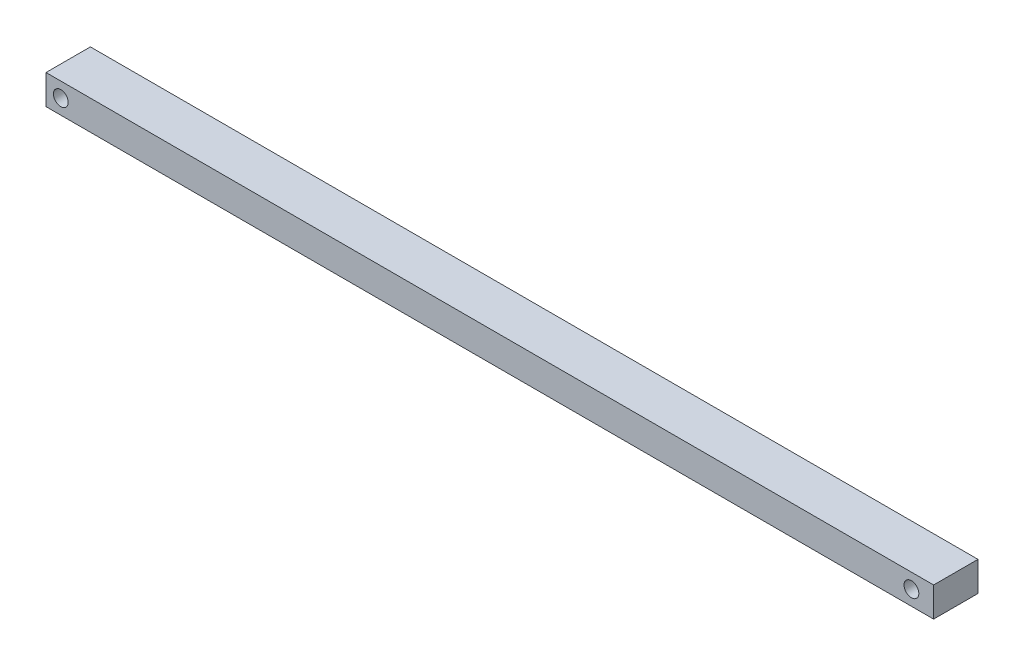
ISO-10303-21;
HEADER;
FILE_DESCRIPTION(('STEP AP214'),'2;1');
FILE_NAME('part.step','',(''),(''),'','','');
FILE_SCHEMA(('AUTOMOTIVE_DESIGN { 1 0 10303 214 1 1 1 1 }'));
ENDSEC;
DATA;
#1=APPLICATION_CONTEXT('core data for automotive mechanical design processes');
#2=APPLICATION_PROTOCOL_DEFINITION('international standard','automotive_design',2000,#1);
#3=PRODUCT_CONTEXT('',#1,'mechanical');
#4=PRODUCT('Part','Part','',(#3));
#5=PRODUCT_RELATED_PRODUCT_CATEGORY('part','',(#4));
#6=PRODUCT_DEFINITION_FORMATION('','',#4);
#7=PRODUCT_DEFINITION_CONTEXT('part definition',#1,'design');
#8=PRODUCT_DEFINITION('design','',#6,#7);
#9=PRODUCT_DEFINITION_SHAPE('','',#8);
#10=(LENGTH_UNIT() NAMED_UNIT(*) SI_UNIT(.MILLI.,.METRE.));
#11=(NAMED_UNIT(*) PLANE_ANGLE_UNIT() SI_UNIT($,.RADIAN.));
#12=(NAMED_UNIT(*) SI_UNIT($,.STERADIAN.) SOLID_ANGLE_UNIT());
#13=UNCERTAINTY_MEASURE_WITH_UNIT(LENGTH_MEASURE(1.E-05),#10,'distance_accuracy_value','');
#14=(GEOMETRIC_REPRESENTATION_CONTEXT(3) GLOBAL_UNCERTAINTY_ASSIGNED_CONTEXT((#13)) GLOBAL_UNIT_ASSIGNED_CONTEXT((#10,
#11,#12)) REPRESENTATION_CONTEXT('',''));
#15=CARTESIAN_POINT('',(0.,0.,0.));
#16=DIRECTION('',(0.,0.,1.));
#17=DIRECTION('',(1.,0.,0.));
#18=AXIS2_PLACEMENT_3D('',#15,#16,#17);
#19=CARTESIAN_POINT('',(0.,0.,-30.));
#20=DIRECTION('',(-1.,0.,0.));
#21=DIRECTION('',(0.,0.,1.));
#22=AXIS2_PLACEMENT_3D('',#19,#20,#21);
#23=PLANE('',#22);
#24=DIRECTION('',(0.,-1.,0.));
#25=VECTOR('',#24,1.);
#26=CARTESIAN_POINT('',(0.,0.,0.));
#27=LINE('',#26,#25);
#28=CARTESIAN_POINT('',(0.,20.,0.));
#29=VERTEX_POINT('',#28);
#30=CARTESIAN_POINT('',(0.,0.,0.));
#31=VERTEX_POINT('',#30);
#32=EDGE_CURVE('E102',#29,#31,#27,.T.);
#33=ORIENTED_EDGE('',*,*,#32,.F.);
#34=DIRECTION('',(0.,0.,1.));
#35=VECTOR('',#34,1.);
#36=CARTESIAN_POINT('',(0.,20.,-30.));
#37=LINE('',#36,#35);
#38=CARTESIAN_POINT('',(0.,20.,-30.));
#39=VERTEX_POINT('',#38);
#40=EDGE_CURVE('E11',#39,#29,#37,.T.);
#41=ORIENTED_EDGE('',*,*,#40,.F.);
#42=DIRECTION('',(0.,-1.,0.));
#43=VECTOR('',#42,1.);
#44=CARTESIAN_POINT('',(0.,0.,-30.));
#45=LINE('',#44,#43);
#46=CARTESIAN_POINT('',(0.,0.,-30.));
#47=VERTEX_POINT('',#46);
#48=EDGE_CURVE('E95',#39,#47,#45,.T.);
#49=ORIENTED_EDGE('',*,*,#48,.T.);
#50=DIRECTION('',(0.,0.,1.));
#51=VECTOR('',#50,1.);
#52=CARTESIAN_POINT('',(0.,0.,-30.));
#53=LINE('',#52,#51);
#54=EDGE_CURVE('E40',#47,#31,#53,.T.);
#55=ORIENTED_EDGE('',*,*,#54,.T.);
#56=EDGE_LOOP('',(#33,#41,#49,#55));
#57=FACE_BOUND('',#56,.T.);
#58=ADVANCED_FACE('F37',(#57),#23,.T.);
#59=CARTESIAN_POINT('',(0.,20.,-30.));
#60=DIRECTION('',(0.,1.,0.));
#61=DIRECTION('',(0.,0.,1.));
#62=AXIS2_PLACEMENT_3D('',#59,#60,#61);
#63=PLANE('',#62);
#64=DIRECTION('',(-1.,0.,0.));
#65=VECTOR('',#64,1.);
#66=CARTESIAN_POINT('',(0.,20.,0.));
#67=LINE('',#66,#65);
#68=CARTESIAN_POINT('',(600.,20.,0.));
#69=VERTEX_POINT('',#68);
#70=EDGE_CURVE('E97',#69,#29,#67,.T.);
#71=ORIENTED_EDGE('',*,*,#70,.F.);
#72=DIRECTION('',(0.,0.,1.));
#73=VECTOR('',#72,1.);
#74=CARTESIAN_POINT('',(600.,20.,-30.));
#75=LINE('',#74,#73);
#76=CARTESIAN_POINT('',(600.,20.,-30.));
#77=VERTEX_POINT('',#76);
#78=EDGE_CURVE('E46',#77,#69,#75,.T.);
#79=ORIENTED_EDGE('',*,*,#78,.F.);
#80=DIRECTION('',(-1.,0.,0.));
#81=VECTOR('',#80,1.);
#82=CARTESIAN_POINT('',(0.,20.,-30.));
#83=LINE('',#82,#81);
#84=EDGE_CURVE('E92',#77,#39,#83,.T.);
#85=ORIENTED_EDGE('',*,*,#84,.T.);
#86=ORIENTED_EDGE('',*,*,#40,.T.);
#87=EDGE_LOOP('',(#71,#79,#85,#86));
#88=FACE_BOUND('',#87,.T.);
#89=ADVANCED_FACE('F113',(#88),#63,.T.);
#90=CARTESIAN_POINT('',(600.,0.,-30.));
#91=DIRECTION('',(1.,0.,0.));
#92=DIRECTION('',(0.,0.,-1.));
#93=AXIS2_PLACEMENT_3D('',#90,#91,#92);
#94=PLANE('',#93);
#95=DIRECTION('',(0.,1.,0.));
#96=VECTOR('',#95,1.);
#97=CARTESIAN_POINT('',(600.,0.,0.));
#98=LINE('',#97,#96);
#99=CARTESIAN_POINT('',(600.,0.,0.));
#100=VERTEX_POINT('',#99);
#101=EDGE_CURVE('E87',#100,#69,#98,.T.);
#102=ORIENTED_EDGE('',*,*,#101,.F.);
#103=DIRECTION('',(0.,0.,1.));
#104=VECTOR('',#103,1.);
#105=CARTESIAN_POINT('',(600.,0.,-30.));
#106=LINE('',#105,#104);
#107=CARTESIAN_POINT('',(600.,0.,-30.));
#108=VERTEX_POINT('',#107);
#109=EDGE_CURVE('E82',#108,#100,#106,.T.);
#110=ORIENTED_EDGE('',*,*,#109,.F.);
#111=DIRECTION('',(0.,1.,0.));
#112=VECTOR('',#111,1.);
#113=CARTESIAN_POINT('',(600.,0.,-30.));
#114=LINE('',#113,#112);
#115=EDGE_CURVE('E85',#108,#77,#114,.T.);
#116=ORIENTED_EDGE('',*,*,#115,.T.);
#117=ORIENTED_EDGE('',*,*,#78,.T.);
#118=EDGE_LOOP('',(#102,#110,#116,#117));
#119=FACE_BOUND('',#118,.T.);
#120=ADVANCED_FACE('F84',(#119),#94,.T.);
#121=CARTESIAN_POINT('',(0.,0.,-30.));
#122=DIRECTION('',(0.,-1.,0.));
#123=DIRECTION('',(0.,0.,-1.));
#124=AXIS2_PLACEMENT_3D('',#121,#122,#123);
#125=PLANE('',#124);
#126=DIRECTION('',(1.,0.,0.));
#127=VECTOR('',#126,1.);
#128=CARTESIAN_POINT('',(0.,0.,0.));
#129=LINE('',#128,#127);
#130=EDGE_CURVE('E105',#31,#100,#129,.T.);
#131=ORIENTED_EDGE('',*,*,#130,.F.);
#132=ORIENTED_EDGE('',*,*,#54,.F.);
#133=DIRECTION('',(1.,0.,0.));
#134=VECTOR('',#133,1.);
#135=CARTESIAN_POINT('',(0.,0.,-30.));
#136=LINE('',#135,#134);
#137=EDGE_CURVE('E91',#47,#108,#136,.T.);
#138=ORIENTED_EDGE('',*,*,#137,.T.);
#139=ORIENTED_EDGE('',*,*,#109,.T.);
#140=EDGE_LOOP('',(#131,#132,#138,#139));
#141=FACE_BOUND('',#140,.T.);
#142=ADVANCED_FACE('F94',(#141),#125,.T.);
#143=CARTESIAN_POINT('',(0.,0.,-30.));
#144=DIRECTION('',(0.,0.,-1.));
#145=DIRECTION('',(-1.,0.,0.));
#146=AXIS2_PLACEMENT_3D('',#143,#144,#145);
#147=PLANE('',#146);
#148=CARTESIAN_POINT('',(585.,10.,-30.));
#149=DIRECTION('',(0.,0.,1.));
#150=DIRECTION('',(1.,0.,0.));
#151=AXIS2_PLACEMENT_3D('',#148,#149,#150);
#152=CIRCLE('',#151,5.00000000000004);
#153=CARTESIAN_POINT('',(590.,10.,-30.));
#154=VERTEX_POINT('',#153);
#155=EDGE_CURVE('E146',#154,#154,#152,.T.);
#156=ORIENTED_EDGE('',*,*,#155,.T.);
#157=EDGE_LOOP('',(#156));
#158=FACE_BOUND('',#157,.T.);
#159=CARTESIAN_POINT('',(10.,10.,-30.));
#160=DIRECTION('',(0.,0.,1.));
#161=DIRECTION('',(1.,0.,0.));
#162=AXIS2_PLACEMENT_3D('',#159,#160,#161);
#163=CIRCLE('',#162,5.);
#164=CARTESIAN_POINT('',(15.,10.,-30.));
#165=VERTEX_POINT('',#164);
#166=EDGE_CURVE('E106',#165,#165,#163,.T.);
#167=ORIENTED_EDGE('',*,*,#166,.T.);
#168=EDGE_LOOP('',(#167));
#169=FACE_BOUND('',#168,.T.);
#170=ORIENTED_EDGE('',*,*,#48,.F.);
#171=ORIENTED_EDGE('',*,*,#84,.F.);
#172=ORIENTED_EDGE('',*,*,#115,.F.);
#173=ORIENTED_EDGE('',*,*,#137,.F.);
#174=EDGE_LOOP('',(#170,#171,#172,#173));
#175=FACE_BOUND('',#174,.T.);
#176=ADVANCED_FACE('F90',(#158,#169,#175),#147,.T.);
#177=CARTESIAN_POINT('',(0.,0.,0.));
#178=DIRECTION('',(0.,0.,-1.));
#179=DIRECTION('',(-1.,0.,0.));
#180=AXIS2_PLACEMENT_3D('',#177,#178,#179);
#181=PLANE('',#180);
#182=CARTESIAN_POINT('',(585.,10.,0.));
#183=DIRECTION('',(0.,0.,1.));
#184=DIRECTION('',(1.,0.,0.));
#185=AXIS2_PLACEMENT_3D('',#182,#183,#184);
#186=CIRCLE('',#185,5.00000000000004);
#187=CARTESIAN_POINT('',(590.,10.,0.));
#188=VERTEX_POINT('',#187);
#189=EDGE_CURVE('E149',#188,#188,#186,.T.);
#190=ORIENTED_EDGE('',*,*,#189,.F.);
#191=EDGE_LOOP('',(#190));
#192=FACE_BOUND('',#191,.T.);
#193=CARTESIAN_POINT('',(10.,10.,0.));
#194=DIRECTION('',(0.,0.,1.));
#195=DIRECTION('',(1.,0.,0.));
#196=AXIS2_PLACEMENT_3D('',#193,#194,#195);
#197=CIRCLE('',#196,5.);
#198=CARTESIAN_POINT('',(15.,10.,0.));
#199=VERTEX_POINT('',#198);
#200=EDGE_CURVE('E151',#199,#199,#197,.T.);
#201=ORIENTED_EDGE('',*,*,#200,.F.);
#202=EDGE_LOOP('',(#201));
#203=FACE_BOUND('',#202,.T.);
#204=ORIENTED_EDGE('',*,*,#32,.T.);
#205=ORIENTED_EDGE('',*,*,#130,.T.);
#206=ORIENTED_EDGE('',*,*,#101,.T.);
#207=ORIENTED_EDGE('',*,*,#70,.T.);
#208=EDGE_LOOP('',(#204,#205,#206,#207));
#209=FACE_BOUND('',#208,.T.);
#210=ADVANCED_FACE('F112',(#192,#203,#209),#181,.F.);
#211=CARTESIAN_POINT('',(10.,10.,-30.));
#212=DIRECTION('',(0.,0.,1.));
#213=DIRECTION('',(1.,0.,0.));
#214=AXIS2_PLACEMENT_3D('',#211,#212,#213);
#215=CYLINDRICAL_SURFACE('',#214,5.);
#216=ORIENTED_EDGE('',*,*,#166,.F.);
#217=EDGE_LOOP('',(#216));
#218=FACE_BOUND('',#217,.T.);
#219=ORIENTED_EDGE('',*,*,#200,.T.);
#220=EDGE_LOOP('',(#219));
#221=FACE_BOUND('',#220,.T.);
#222=ADVANCED_FACE('F131',(#218,#221),#215,.F.);
#223=CARTESIAN_POINT('',(585.,10.,-30.));
#224=DIRECTION('',(0.,0.,1.));
#225=DIRECTION('',(1.,0.,0.));
#226=AXIS2_PLACEMENT_3D('',#223,#224,#225);
#227=CYLINDRICAL_SURFACE('',#226,5.00000000000004);
#228=ORIENTED_EDGE('',*,*,#155,.F.);
#229=EDGE_LOOP('',(#228));
#230=FACE_BOUND('',#229,.T.);
#231=ORIENTED_EDGE('',*,*,#189,.T.);
#232=EDGE_LOOP('',(#231));
#233=FACE_BOUND('',#232,.T.);
#234=ADVANCED_FACE('F138',(#230,#233),#227,.F.);
#235=CLOSED_SHELL('',(#58,#89,#120,#142,#176,#210,#222,#234));
#236=MANIFOLD_SOLID_BREP('B2',#235);
#237=ADVANCED_BREP_SHAPE_REPRESENTATION('',(#18,#236),#14);
#238=SHAPE_DEFINITION_REPRESENTATION(#9,#237);
ENDSEC;
END-ISO-10303-21;
